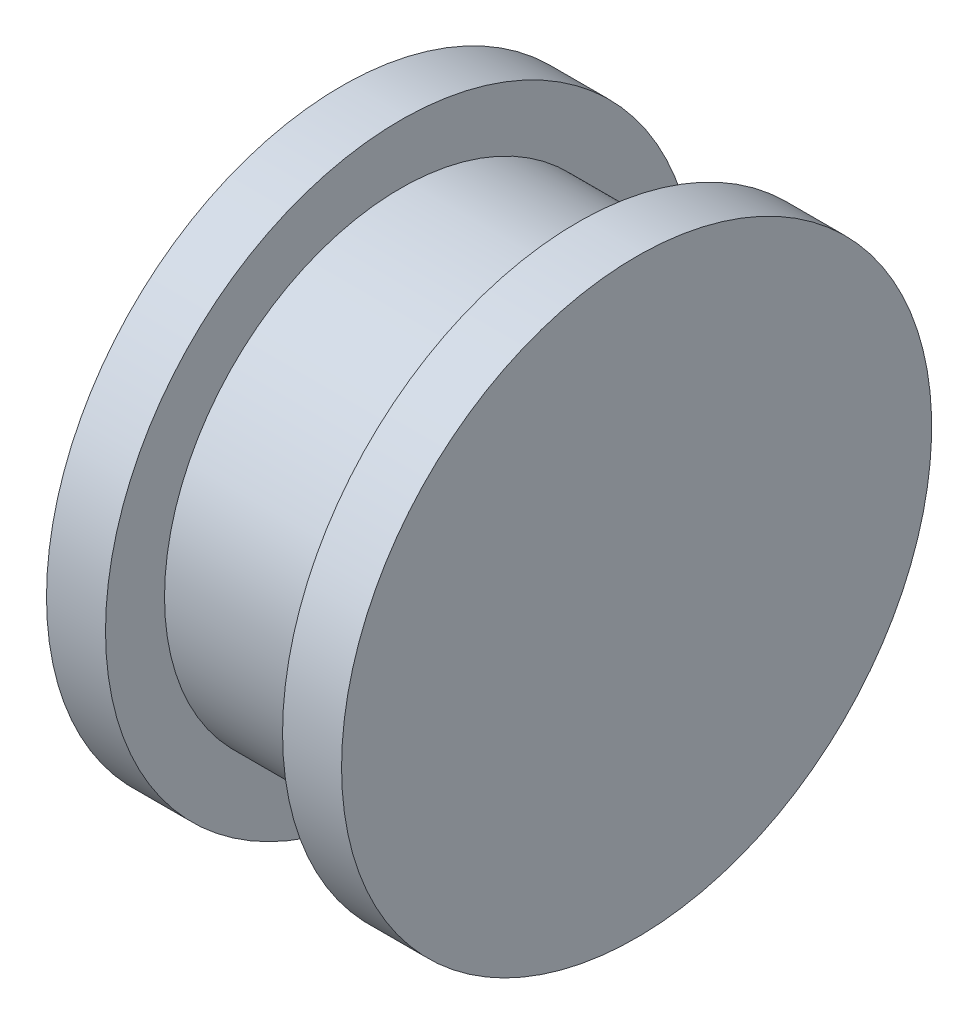
ISO-10303-21;
HEADER;
FILE_DESCRIPTION(('STEP AP214'),'2;1');
FILE_NAME('part.step','',(''),(''),'','','');
FILE_SCHEMA(('AUTOMOTIVE_DESIGN { 1 0 10303 214 1 1 1 1 }'));
ENDSEC;
DATA;
#1=APPLICATION_CONTEXT('core data for automotive mechanical design processes');
#2=APPLICATION_PROTOCOL_DEFINITION('international standard','automotive_design',2000,#1);
#3=PRODUCT_CONTEXT('',#1,'mechanical');
#4=PRODUCT('Part','Part','',(#3));
#5=PRODUCT_RELATED_PRODUCT_CATEGORY('part','',(#4));
#6=PRODUCT_DEFINITION_FORMATION('','',#4);
#7=PRODUCT_DEFINITION_CONTEXT('part definition',#1,'design');
#8=PRODUCT_DEFINITION('design','',#6,#7);
#9=PRODUCT_DEFINITION_SHAPE('','',#8);
#10=(LENGTH_UNIT() NAMED_UNIT(*) SI_UNIT(.MILLI.,.METRE.));
#11=(NAMED_UNIT(*) PLANE_ANGLE_UNIT() SI_UNIT($,.RADIAN.));
#12=(NAMED_UNIT(*) SI_UNIT($,.STERADIAN.) SOLID_ANGLE_UNIT());
#13=UNCERTAINTY_MEASURE_WITH_UNIT(LENGTH_MEASURE(1.E-05),#10,'distance_accuracy_value','');
#14=(GEOMETRIC_REPRESENTATION_CONTEXT(3) GLOBAL_UNCERTAINTY_ASSIGNED_CONTEXT((#13)) GLOBAL_UNIT_ASSIGNED_CONTEXT((#10,
#11,#12)) REPRESENTATION_CONTEXT('',''));
#15=CARTESIAN_POINT('',(0.,0.,0.));
#16=DIRECTION('',(0.,0.,1.));
#17=DIRECTION('',(1.,0.,0.));
#18=AXIS2_PLACEMENT_3D('',#15,#16,#17);
#19=CARTESIAN_POINT('',(0.,0.,0.));
#20=DIRECTION('',(-1.,0.,0.));
#21=DIRECTION('',(0.,0.,1.));
#22=AXIS2_PLACEMENT_3D('',#19,#20,#21);
#23=CYLINDRICAL_SURFACE('',#22,5.);
#24=CARTESIAN_POINT('',(-4.,0.,0.));
#25=DIRECTION('',(-1.,0.,0.));
#26=DIRECTION('',(0.,0.,1.));
#27=AXIS2_PLACEMENT_3D('',#24,#25,#26);
#28=CIRCLE('',#27,5.);
#29=CARTESIAN_POINT('',(-4.,0.,5.));
#30=VERTEX_POINT('',#29);
#31=EDGE_CURVE('E10',#30,#30,#28,.T.);
#32=ORIENTED_EDGE('',*,*,#31,.T.);
#33=EDGE_LOOP('',(#32));
#34=FACE_BOUND('',#33,.T.);
#35=CARTESIAN_POINT('',(-5.,0.,0.));
#36=DIRECTION('',(-1.,0.,0.));
#37=DIRECTION('',(0.,0.,1.));
#38=AXIS2_PLACEMENT_3D('',#35,#36,#37);
#39=CIRCLE('',#38,5.);
#40=CARTESIAN_POINT('',(-5.,0.,5.));
#41=VERTEX_POINT('',#40);
#42=EDGE_CURVE('E61',#41,#41,#39,.T.);
#43=ORIENTED_EDGE('',*,*,#42,.F.);
#44=EDGE_LOOP('',(#43));
#45=FACE_BOUND('',#44,.T.);
#46=ADVANCED_FACE('F33',(#34,#45),#23,.T.);
#47=CARTESIAN_POINT('',(-4.,-5.,0.));
#48=DIRECTION('',(1.,0.,0.));
#49=DIRECTION('',(0.,0.,-1.));
#50=AXIS2_PLACEMENT_3D('',#47,#48,#49);
#51=PLANE('',#50);
#52=CARTESIAN_POINT('',(-4.,0.,0.));
#53=DIRECTION('',(-1.,0.,0.));
#54=DIRECTION('',(0.,0.,1.));
#55=AXIS2_PLACEMENT_3D('',#52,#53,#54);
#56=CIRCLE('',#55,4.);
#57=CARTESIAN_POINT('',(-4.,0.,4.));
#58=VERTEX_POINT('',#57);
#59=EDGE_CURVE('E39',#58,#58,#56,.T.);
#60=ORIENTED_EDGE('',*,*,#59,.T.);
#61=EDGE_LOOP('',(#60));
#62=FACE_BOUND('',#61,.T.);
#63=ORIENTED_EDGE('',*,*,#31,.F.);
#64=EDGE_LOOP('',(#63));
#65=FACE_BOUND('',#64,.T.);
#66=ADVANCED_FACE('F69',(#62,#65),#51,.T.);
#67=CARTESIAN_POINT('',(0.,0.,0.));
#68=DIRECTION('',(-1.,0.,0.));
#69=DIRECTION('',(0.,0.,1.));
#70=AXIS2_PLACEMENT_3D('',#67,#68,#69);
#71=CYLINDRICAL_SURFACE('',#70,4.);
#72=CARTESIAN_POINT('',(-1.,0.,0.));
#73=DIRECTION('',(-1.,0.,0.));
#74=DIRECTION('',(0.,0.,1.));
#75=AXIS2_PLACEMENT_3D('',#72,#73,#74);
#76=CIRCLE('',#75,4.);
#77=CARTESIAN_POINT('',(-1.,0.,4.));
#78=VERTEX_POINT('',#77);
#79=EDGE_CURVE('E43',#78,#78,#76,.T.);
#80=ORIENTED_EDGE('',*,*,#79,.T.);
#81=EDGE_LOOP('',(#80));
#82=FACE_BOUND('',#81,.T.);
#83=ORIENTED_EDGE('',*,*,#59,.F.);
#84=EDGE_LOOP('',(#83));
#85=FACE_BOUND('',#84,.T.);
#86=ADVANCED_FACE('F73',(#82,#85),#71,.T.);
#87=CARTESIAN_POINT('',(-1.,-4.,0.));
#88=DIRECTION('',(-1.,0.,0.));
#89=DIRECTION('',(0.,0.,1.));
#90=AXIS2_PLACEMENT_3D('',#87,#88,#89);
#91=PLANE('',#90);
#92=CARTESIAN_POINT('',(-1.,0.,0.));
#93=DIRECTION('',(-1.,0.,0.));
#94=DIRECTION('',(0.,0.,1.));
#95=AXIS2_PLACEMENT_3D('',#92,#93,#94);
#96=CIRCLE('',#95,5.);
#97=CARTESIAN_POINT('',(-1.,0.,5.));
#98=VERTEX_POINT('',#97);
#99=EDGE_CURVE('E47',#98,#98,#96,.T.);
#100=ORIENTED_EDGE('',*,*,#99,.T.);
#101=EDGE_LOOP('',(#100));
#102=FACE_BOUND('',#101,.T.);
#103=ORIENTED_EDGE('',*,*,#79,.F.);
#104=EDGE_LOOP('',(#103));
#105=FACE_BOUND('',#104,.T.);
#106=ADVANCED_FACE('F77',(#102,#105),#91,.T.);
#107=CARTESIAN_POINT('',(0.,0.,0.));
#108=DIRECTION('',(-1.,0.,0.));
#109=DIRECTION('',(0.,0.,1.));
#110=AXIS2_PLACEMENT_3D('',#107,#108,#109);
#111=CYLINDRICAL_SURFACE('',#110,5.);
#112=CARTESIAN_POINT('',(0.,0.,0.));
#113=DIRECTION('',(-1.,0.,0.));
#114=DIRECTION('',(0.,0.,1.));
#115=AXIS2_PLACEMENT_3D('',#112,#113,#114);
#116=CIRCLE('',#115,5.);
#117=CARTESIAN_POINT('',(0.,0.,5.));
#118=VERTEX_POINT('',#117);
#119=EDGE_CURVE('E52',#118,#118,#116,.T.);
#120=ORIENTED_EDGE('',*,*,#119,.T.);
#121=EDGE_LOOP('',(#120));
#122=FACE_BOUND('',#121,.T.);
#123=ORIENTED_EDGE('',*,*,#99,.F.);
#124=EDGE_LOOP('',(#123));
#125=FACE_BOUND('',#124,.T.);
#126=ADVANCED_FACE('F84',(#122,#125),#111,.T.);
#127=CARTESIAN_POINT('',(0.,-5.,0.));
#128=DIRECTION('',(1.,0.,0.));
#129=DIRECTION('',(0.,0.,-1.));
#130=AXIS2_PLACEMENT_3D('',#127,#128,#129);
#131=PLANE('',#130);
#132=ORIENTED_EDGE('',*,*,#119,.F.);
#133=EDGE_LOOP('',(#132));
#134=FACE_BOUND('',#133,.T.);
#135=ADVANCED_FACE('F88',(#134),#131,.T.);
#136=CARTESIAN_POINT('',(-1.,0.,0.));
#137=DIRECTION('',(-1.,0.,0.));
#138=DIRECTION('',(0.,0.,1.));
#139=AXIS2_PLACEMENT_3D('',#136,#137,#138);
#140=PLANE('',#139);
#141=CARTESIAN_POINT('',(-1.,0.,0.));
#142=DIRECTION('',(-1.,0.,0.));
#143=DIRECTION('',(0.,0.,1.));
#144=AXIS2_PLACEMENT_3D('',#141,#142,#143);
#145=CIRCLE('',#144,3.);
#146=CARTESIAN_POINT('',(-1.,0.,3.));
#147=VERTEX_POINT('',#146);
#148=EDGE_CURVE('E55',#147,#147,#145,.T.);
#149=ORIENTED_EDGE('',*,*,#148,.T.);
#150=EDGE_LOOP('',(#149));
#151=FACE_BOUND('',#150,.T.);
#152=ADVANCED_FACE('F92',(#151),#140,.T.);
#153=CARTESIAN_POINT('',(0.,0.,0.));
#154=DIRECTION('',(-1.,0.,0.));
#155=DIRECTION('',(0.,0.,1.));
#156=AXIS2_PLACEMENT_3D('',#153,#154,#155);
#157=CYLINDRICAL_SURFACE('',#156,3.);
#158=CARTESIAN_POINT('',(-5.,0.,0.));
#159=DIRECTION('',(-1.,0.,0.));
#160=DIRECTION('',(0.,0.,1.));
#161=AXIS2_PLACEMENT_3D('',#158,#159,#160);
#162=CIRCLE('',#161,3.);
#163=CARTESIAN_POINT('',(-5.,0.,3.));
#164=VERTEX_POINT('',#163);
#165=EDGE_CURVE('E58',#164,#164,#162,.T.);
#166=ORIENTED_EDGE('',*,*,#165,.T.);
#167=EDGE_LOOP('',(#166));
#168=FACE_BOUND('',#167,.T.);
#169=ORIENTED_EDGE('',*,*,#148,.F.);
#170=EDGE_LOOP('',(#169));
#171=FACE_BOUND('',#170,.T.);
#172=ADVANCED_FACE('F96',(#168,#171),#157,.F.);
#173=CARTESIAN_POINT('',(-5.,-3.,0.));
#174=DIRECTION('',(-1.,0.,0.));
#175=DIRECTION('',(0.,0.,1.));
#176=AXIS2_PLACEMENT_3D('',#173,#174,#175);
#177=PLANE('',#176);
#178=ORIENTED_EDGE('',*,*,#42,.T.);
#179=EDGE_LOOP('',(#178));
#180=FACE_BOUND('',#179,.T.);
#181=ORIENTED_EDGE('',*,*,#165,.F.);
#182=EDGE_LOOP('',(#181));
#183=FACE_BOUND('',#182,.T.);
#184=ADVANCED_FACE('F65',(#180,#183),#177,.T.);
#185=CLOSED_SHELL('',(#46,#66,#86,#106,#126,#135,#152,#172,#184));
#186=MANIFOLD_SOLID_BREP('B2',#185);
#187=ADVANCED_BREP_SHAPE_REPRESENTATION('',(#18,#186),#14);
#188=SHAPE_DEFINITION_REPRESENTATION(#9,#187);
ENDSEC;
END-ISO-10303-21;
